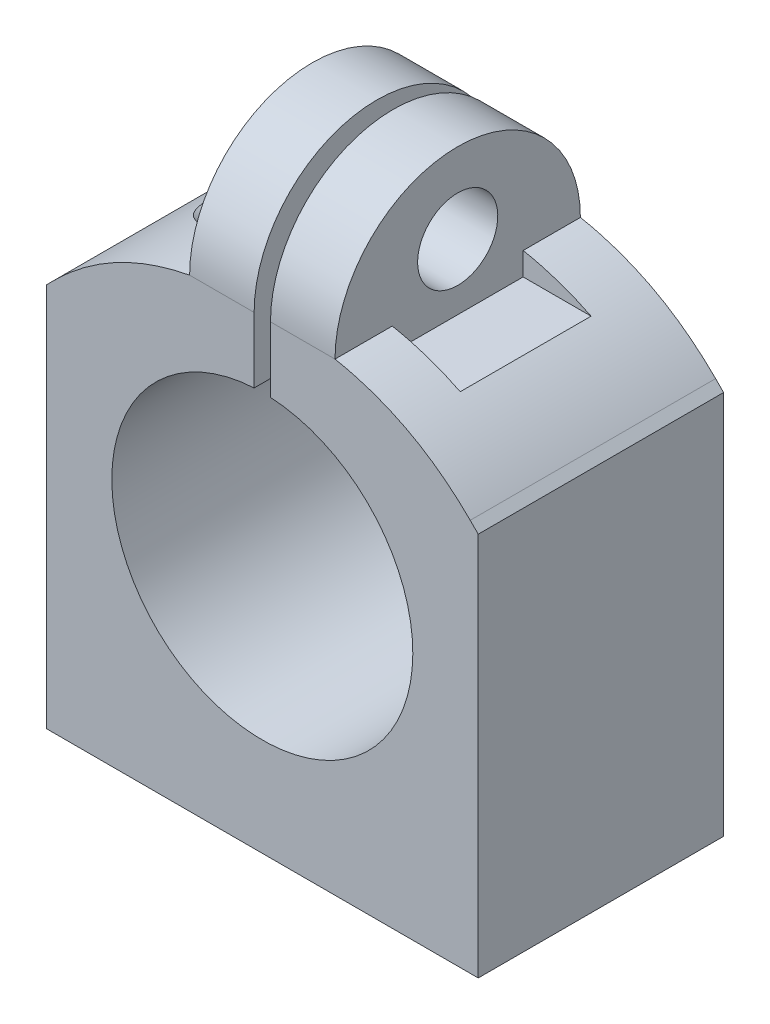
ISO-10303-21;
HEADER;
FILE_DESCRIPTION(('STEP AP214'),'2;1');
FILE_NAME('part.step','',(''),(''),'','','');
FILE_SCHEMA(('AUTOMOTIVE_DESIGN { 1 0 10303 214 1 1 1 1 }'));
ENDSEC;
DATA;
#1=APPLICATION_CONTEXT('core data for automotive mechanical design processes');
#2=APPLICATION_PROTOCOL_DEFINITION('international standard','automotive_design',2000,#1);
#3=PRODUCT_CONTEXT('',#1,'mechanical');
#4=PRODUCT('Part','Part','',(#3));
#5=PRODUCT_RELATED_PRODUCT_CATEGORY('part','',(#4));
#6=PRODUCT_DEFINITION_FORMATION('','',#4);
#7=PRODUCT_DEFINITION_CONTEXT('part definition',#1,'design');
#8=PRODUCT_DEFINITION('design','',#6,#7);
#9=PRODUCT_DEFINITION_SHAPE('','',#8);
#10=(LENGTH_UNIT() NAMED_UNIT(*) SI_UNIT(.MILLI.,.METRE.));
#11=(NAMED_UNIT(*) PLANE_ANGLE_UNIT() SI_UNIT($,.RADIAN.));
#12=(NAMED_UNIT(*) SI_UNIT($,.STERADIAN.) SOLID_ANGLE_UNIT());
#13=UNCERTAINTY_MEASURE_WITH_UNIT(LENGTH_MEASURE(1.E-05),#10,'distance_accuracy_value','');
#14=(GEOMETRIC_REPRESENTATION_CONTEXT(3) GLOBAL_UNCERTAINTY_ASSIGNED_CONTEXT((#13)) GLOBAL_UNIT_ASSIGNED_CONTEXT((#10,
#11,#12)) REPRESENTATION_CONTEXT('',''));
#15=CARTESIAN_POINT('',(0.,0.,0.));
#16=DIRECTION('',(0.,0.,1.));
#17=DIRECTION('',(1.,0.,0.));
#18=AXIS2_PLACEMENT_3D('',#15,#16,#17);
#19=CARTESIAN_POINT('',(16.1412468034704,11.1587318045801,19.05));
#20=CARTESIAN_POINT('',(11.7116648310228,15.5883137770274,19.05));
#21=CARTESIAN_POINT('',(5.64388,16.7467318045801,19.05));
#22=B_SPLINE_CURVE_WITH_KNOTS('',2,(#19,#20,#21),.UNSPECIFIED.,.F.,.F.,(3,3),(0.,1.),.UNSPECIFIED.);
#23=DIRECTION('',(0.,0.,-1.));
#24=VECTOR('',#23,1.);
#25=SURFACE_OF_LINEAR_EXTRUSION('',#22,#24);
#26=CARTESIAN_POINT('',(16.1412468034704,11.1587318045801,14.605));
#27=CARTESIAN_POINT('',(11.7116648310228,15.5883137770274,14.605));
#28=CARTESIAN_POINT('',(5.64388,16.7467318045801,14.605));
#29=B_SPLINE_CURVE_WITH_KNOTS('',2,(#26,#27,#28),.UNSPECIFIED.,.F.,.F.,(3,3),(0.,1.),.UNSPECIFIED.);
#30=CARTESIAN_POINT('',(5.64388,16.7467318045801,14.605));
#31=VERTEX_POINT('',#30);
#32=CARTESIAN_POINT('',(10.9195458937569,14.9687318045801,14.605));
#33=VERTEX_POINT('',#32);
#34=EDGE_CURVE('E11',#31,#33,#29,.F.);
#35=ORIENTED_EDGE('',*,*,#34,.F.);
#36=DIRECTION('',(0.,0.,1.));
#37=VECTOR('',#36,1.);
#38=CARTESIAN_POINT('',(5.64388,16.7467318045801,19.05));
#39=LINE('',#38,#37);
#40=CARTESIAN_POINT('',(5.64388,16.7467318045801,19.05));
#41=VERTEX_POINT('',#40);
#42=EDGE_CURVE('E166',#31,#41,#39,.T.);
#43=ORIENTED_EDGE('',*,*,#42,.T.);
#44=CARTESIAN_POINT('',(16.1412468034704,11.1587318045801,19.05));
#45=VERTEX_POINT('',#44);
#46=EDGE_CURVE('E176',#45,#41,#22,.T.);
#47=ORIENTED_EDGE('',*,*,#46,.F.);
#48=DIRECTION('',(0.,0.,-1.));
#49=VECTOR('',#48,1.);
#50=CARTESIAN_POINT('',(16.1412468034704,11.1587318045801,19.05));
#51=LINE('',#50,#49);
#52=CARTESIAN_POINT('',(16.1412468034704,11.1587318045801,0.));
#53=VERTEX_POINT('',#52);
#54=EDGE_CURVE('E182',#45,#53,#51,.T.);
#55=ORIENTED_EDGE('',*,*,#54,.T.);
#56=CARTESIAN_POINT('',(16.1412468034704,11.1587318045801,0.));
#57=CARTESIAN_POINT('',(11.7116648310228,15.5883137770274,0.));
#58=CARTESIAN_POINT('',(5.64388,16.7467318045801,0.));
#59=B_SPLINE_CURVE_WITH_KNOTS('',2,(#56,#57,#58),.UNSPECIFIED.,.F.,.F.,(3,3),(0.,1.),.UNSPECIFIED.);
#60=CARTESIAN_POINT('',(5.64388,16.7467318045801,0.));
#61=VERTEX_POINT('',#60);
#62=EDGE_CURVE('E183',#53,#61,#59,.T.);
#63=ORIENTED_EDGE('',*,*,#62,.T.);
#64=CARTESIAN_POINT('',(5.64388,16.7467318045801,4.44500000000001));
#65=VERTEX_POINT('',#64);
#66=EDGE_CURVE('E244',#61,#65,#39,.T.);
#67=ORIENTED_EDGE('',*,*,#66,.T.);
#68=CARTESIAN_POINT('',(16.1412468034704,11.1587318045801,4.445));
#69=CARTESIAN_POINT('',(11.7116648310228,15.5883137770274,4.445));
#70=CARTESIAN_POINT('',(5.64388,16.7467318045801,4.445));
#71=B_SPLINE_CURVE_WITH_KNOTS('',2,(#68,#69,#70),.UNSPECIFIED.,.F.,.F.,(3,3),(0.,1.),.UNSPECIFIED.);
#72=CARTESIAN_POINT('',(10.9195458922964,14.9687318045801,4.445));
#73=VERTEX_POINT('',#72);
#74=EDGE_CURVE('E318',#73,#65,#71,.T.);
#75=ORIENTED_EDGE('',*,*,#74,.F.);
#76=DIRECTION('',(0.,0.,-1.));
#77=VECTOR('',#76,1.);
#78=CARTESIAN_POINT('',(10.9195458937569,14.9687318045801,19.05));
#79=LINE('',#78,#77);
#80=EDGE_CURVE('E47',#33,#73,#79,.T.);
#81=ORIENTED_EDGE('',*,*,#80,.F.);
#82=EDGE_LOOP('',(#35,#43,#47,#55,#63,#67,#75,#81));
#83=FACE_BOUND('',#82,.T.);
#84=ADVANCED_FACE('F37',(#83),#25,.F.);
#85=CARTESIAN_POINT('',(-5.64388,16.7467318045801,19.05));
#86=CARTESIAN_POINT('',(-11.7116648310228,15.5883137770274,19.05));
#87=CARTESIAN_POINT('',(-16.1412468034704,11.1587318045801,19.05));
#88=B_SPLINE_CURVE_WITH_KNOTS('',2,(#85,#86,#87),.UNSPECIFIED.,.F.,.F.,(3,3),(0.,1.),.UNSPECIFIED.);
#89=DIRECTION('',(0.,0.,-1.));
#90=VECTOR('',#89,1.);
#91=SURFACE_OF_LINEAR_EXTRUSION('',#88,#90);
#92=CARTESIAN_POINT('',(-5.64388,16.7467318045801,4.10104424796809));
#93=CARTESIAN_POINT('',(-5.83876272085071,16.7095333677369,4.12371118552078));
#94=CARTESIAN_POINT('',(-6.03291552509635,16.669687528954,4.14847334587737));
#95=CARTESIAN_POINT('',(-6.42041897900057,16.5845045130469,4.20294567316754));
#96=CARTESIAN_POINT('',(-6.61375979121458,16.5391391174929,4.2326815849274));
#97=CARTESIAN_POINT('',(-6.99878593010375,16.4429736227702,4.29772802620363));
#98=CARTESIAN_POINT('',(-7.19046448922835,16.3921575160689,4.33305512872525));
#99=CARTESIAN_POINT('',(-7.57130883909651,16.285258801679,4.41001039926246));
#100=CARTESIAN_POINT('',(-7.76047169686205,16.2291705731692,4.45164532189463));
#101=CARTESIAN_POINT('',(-8.1384334461401,16.1110617691429,4.54274110044235));
#102=CARTESIAN_POINT('',(-8.32718117117379,16.0489626645318,4.59231333799937));
#103=CARTESIAN_POINT('',(-8.70035594998138,15.9200003443668,4.69974230882234));
#104=CARTESIAN_POINT('',(-8.88478857207379,15.8531437764274,4.75758759207069));
#105=CARTESIAN_POINT('',(-9.24847194291285,15.7151892663587,4.88263388763812));
#106=CARTESIAN_POINT('',(-9.42773069763772,15.6440984635611,4.94981939314735));
#107=CARTESIAN_POINT('',(-9.78021787818885,15.4983240635529,5.09478004822136));
#108=CARTESIAN_POINT('',(-9.95345210020067,15.423644094103,5.17254464469194));
#109=CARTESIAN_POINT('',(-10.2538508399491,15.2890452447873,5.32078005501611));
#110=CARTESIAN_POINT('',(-10.3824590996691,15.2296750045255,5.38882469635271));
#111=CARTESIAN_POINT('',(-10.6348188685891,15.1098823752604,5.5326289379613));
#112=CARTESIAN_POINT('',(-10.7585700315244,15.0494599116853,5.6083890868961));
#113=CARTESIAN_POINT('',(-11.0001572622033,14.9283931495125,5.7680535626813));
#114=CARTESIAN_POINT('',(-11.1180056626025,14.8677496240033,5.85193973440194));
#115=CARTESIAN_POINT('',(-11.3471710685858,14.74695365979,6.0285598673157));
#116=CARTESIAN_POINT('',(-11.4584882072619,14.6868012111005,6.12129364811385));
#117=CARTESIAN_POINT('',(-11.675053905233,14.5671689612151,6.31745438366005));
#118=CARTESIAN_POINT('',(-11.7801957033445,14.5077103625798,6.42101285196015));
#119=CARTESIAN_POINT('',(-11.9814150120943,14.3916073119585,6.63803333137685));
#120=CARTESIAN_POINT('',(-12.0774950019625,14.3349620922766,6.75149261726766));
#121=CARTESIAN_POINT('',(-12.2590747629084,14.2259975320289,6.98822717781111));
#122=CARTESIAN_POINT('',(-12.3445911311581,14.1736714494493,7.11148654084756));
#123=CARTESIAN_POINT('',(-12.50367399398,14.0748542412786,7.36766340295111));
#124=CARTESIAN_POINT('',(-12.5772470218939,14.0283599287319,7.50057556367792));
#125=CARTESIAN_POINT('',(-12.6892812901978,13.9566911272709,7.73083636504465));
#126=CARTESIAN_POINT('',(-12.7314034760112,13.9294841013277,7.82578778200942));
#127=CARTESIAN_POINT('',(-12.8090062546073,13.8790019727924,8.01936726886827));
#128=CARTESIAN_POINT('',(-12.8444886864336,13.8557257816333,8.11799431160463));
#129=CARTESIAN_POINT('',(-12.9083698548833,13.8135816961148,8.31839990810833));
#130=CARTESIAN_POINT('',(-12.9367711292623,13.7947122226234,8.42017731809985));
#131=CARTESIAN_POINT('',(-12.9861276394158,13.7617832264626,8.62629638861711));
#132=CARTESIAN_POINT('',(-13.0070826199767,13.7477238686552,8.73063813690169));
#133=CARTESIAN_POINT('',(-13.0413182833062,13.7246937558235,8.94160495931614));
#134=CARTESIAN_POINT('',(-13.0545651464894,13.715745428703,9.04823799848435));
#135=CARTESIAN_POINT('',(-13.0730413587428,13.7032517060844,9.26251383059577));
#136=CARTESIAN_POINT('',(-13.0782707174686,13.6997063040795,9.37015662232277));
#137=CARTESIAN_POINT('',(-13.0806305513674,13.6981072821,9.58556032575658));
#138=CARTESIAN_POINT('',(-13.0777618779419,13.7000530847976,9.69332122385533));
#139=CARTESIAN_POINT('',(-13.0639719746091,13.7093865798133,9.90808460001552));
#140=CARTESIAN_POINT('',(-13.0530510576048,13.7167740606728,10.0150871073842));
#141=CARTESIAN_POINT('',(-13.0243003220101,13.7361500647924,10.2205222687062));
#142=CARTESIAN_POINT('',(-13.0069700443522,13.7478054225239,10.3190570796517));
#143=CARTESIAN_POINT('',(-12.9656424813872,13.7754682337352,10.5141274397921));
#144=CARTESIAN_POINT('',(-12.9416429185871,13.791477173879,10.6106622938996));
#145=CARTESIAN_POINT('',(-12.8872756405885,13.8275251653504,10.8011176147518));
#146=CARTESIAN_POINT('',(-12.856909751395,13.847563061016,10.895038822418));
#147=CARTESIAN_POINT('',(-12.7901497909373,13.8912995703308,11.0798512409421));
#148=CARTESIAN_POINT('',(-12.7537534681279,13.914999551046,11.1707413047972));
#149=CARTESIAN_POINT('',(-12.6310812355288,13.9942123282062,11.4496007746244));
#150=CARTESIAN_POINT('',(-12.5347885810566,14.0554966123291,11.6316386687529));
#151=CARTESIAN_POINT('',(-12.3204457555855,14.1886990054286,11.9779707488965));
#152=CARTESIAN_POINT('',(-12.202384878887,14.2606223432781,12.1422561408286));
#153=CARTESIAN_POINT('',(-11.9747808607574,14.3954917978361,12.4201678703153));
#154=CARTESIAN_POINT('',(-11.868604241511,14.4571777829359,12.5372103314103));
#155=CARTESIAN_POINT('',(-11.6465148452589,14.5831654964753,12.7601963322073));
#156=CARTESIAN_POINT('',(-11.5305975001434,14.6474684448204,12.86613461145));
#157=CARTESIAN_POINT('',(-11.2902921910183,14.7773577040348,13.0675279098388));
#158=CARTESIAN_POINT('',(-11.1658892898411,14.8429461251835,13.1629636273245));
#159=CARTESIAN_POINT('',(-10.9099994529037,14.9741402999367,13.3438349452192));
#160=CARTESIAN_POINT('',(-10.7785101155373,15.0397460518233,13.4292671238924));
#161=CARTESIAN_POINT('',(-10.4347389601138,15.2062083188998,13.6357892226522));
#162=CARTESIAN_POINT('',(-10.2181699380064,15.3063916149077,13.7503079955165));
#163=CARTESIAN_POINT('',(-9.77363074766146,15.5017626094611,13.9598727849418));
#164=CARTESIAN_POINT('',(-9.5456535460309,15.5969471501785,14.0549065999119));
#165=CARTESIAN_POINT('',(-9.08019752121372,15.7807308995197,14.2284752220874));
#166=CARTESIAN_POINT('',(-8.84269467758003,15.8693116097939,14.3069647315274));
#167=CARTESIAN_POINT('',(-8.36074432347158,16.038401332662,14.4496301409447));
#168=CARTESIAN_POINT('',(-8.11629865886327,16.1189124653809,14.513809806011));
#169=CARTESIAN_POINT('',(-7.68761815235323,16.2509424615441,14.6146189977766));
#170=CARTESIAN_POINT('',(-7.50464513904355,16.3044802058054,14.6540374701162));
#171=CARTESIAN_POINT('',(-7.13620926034942,16.4066768073338,14.7271035544538));
#172=CARTESIAN_POINT('',(-6.95074648150425,16.4553358336801,14.7607513664713));
#173=CARTESIAN_POINT('',(-6.5793180135364,16.5472896174873,14.8226845179848));
#174=CARTESIAN_POINT('',(-6.39336968067552,16.5906260586288,14.8510125884162));
#175=CARTESIAN_POINT('',(-6.01980195997387,16.6723750312542,14.9031978958133));
#176=CARTESIAN_POINT('',(-5.83218285895034,16.7107883910872,14.92705588522));
#177=CARTESIAN_POINT('',(-5.64388,16.7467318045801,14.9489557520319));
#178=B_SPLINE_CURVE_WITH_KNOTS('',3,(#92,#93,#94,#95,#96,#97,#98,#99,#100,#101,#102,#103,#104,
#105,#106,#107,#108,#109,#110,#111,#112,#113,#114,#115,#116,#117,#118,#119,#120,#121,#122,#123,
#124,#125,#126,#127,#128,#129,#130,#131,#132,#133,#134,#135,#136,#137,#138,#139,#140,#141,#142,
#143,#144,#145,#146,#147,#148,#149,#150,#151,#152,#153,#154,#155,#156,#157,#158,#159,#160,#161,
#162,#163,#164,#165,#166,#167,#168,#169,#170,#171,#172,#173,#174,#175,#176,#177),.UNSPECIFIED.,
.F.,.F.,(4,2,2,2,2,2,2,2,2,2,2,2,2,2,2,2,2,2,2,2,2,2,2,2,2,2,2,2,2,2,2,2,2,2,2,2,2,2,2,2,2,2,4),
(0.,0.599073305745289,1.20134931860823,1.80544519447173,2.41019258857334,3.02432119896611,
3.63760792684838,4.24988836120451,4.86156243818613,5.33276657234744,5.80400423806,
6.27421233815587,6.74441085317078,7.22119127270201,7.69784086865633,8.17373177878995,
8.64936147957325,8.97119605838603,9.292941364806,9.61457119738968,9.93621205241921,
10.2592536773561,10.582294913248,10.9053021868708,11.2282969093897,11.5301294971872,
11.8320652846739,12.1339145884005,12.4358768467247,13.0778640988304,13.7201679291255,
14.2283922172134,14.7368561919043,15.2462395456617,15.755796629435,16.5485531217243,
17.341804536553,18.1372004181867,18.9323867741661,19.5162597332789,20.1001124504068,
20.6790534583325,21.2578969263897),.UNSPECIFIED.);
#179=CARTESIAN_POINT('',(-5.64388,16.7467318045801,4.10104424796809));
#180=VERTEX_POINT('',#179);
#181=CARTESIAN_POINT('',(-5.64388,16.7467318045801,14.9489557520319));
#182=VERTEX_POINT('',#181);
#183=EDGE_CURVE('E312',#180,#182,#178,.T.);
#184=ORIENTED_EDGE('',*,*,#183,.F.);
#185=DIRECTION('',(0.,0.,1.));
#186=VECTOR('',#185,1.);
#187=CARTESIAN_POINT('',(-5.64388,16.7467318045801,19.05));
#188=LINE('',#187,#186);
#189=CARTESIAN_POINT('',(-5.64388,16.7467318045801,0.));
#190=VERTEX_POINT('',#189);
#191=EDGE_CURVE('E231',#190,#180,#188,.T.);
#192=ORIENTED_EDGE('',*,*,#191,.F.);
#193=CARTESIAN_POINT('',(-5.64388,16.7467318045801,0.));
#194=CARTESIAN_POINT('',(-11.7116648310228,15.5883137770274,0.));
#195=CARTESIAN_POINT('',(-16.1412468034704,11.1587318045801,0.));
#196=B_SPLINE_CURVE_WITH_KNOTS('',2,(#193,#194,#195),.UNSPECIFIED.,.F.,.F.,(3,3),(0.,1.),.UNSPECIFIED.);
#197=CARTESIAN_POINT('',(-16.1412468034704,11.1587318045801,0.));
#198=VERTEX_POINT('',#197);
#199=EDGE_CURVE('E214',#190,#198,#196,.T.);
#200=ORIENTED_EDGE('',*,*,#199,.T.);
#201=DIRECTION('',(0.,0.,-1.));
#202=VECTOR('',#201,1.);
#203=CARTESIAN_POINT('',(-16.1412468034704,11.1587318045801,19.05));
#204=LINE('',#203,#202);
#205=CARTESIAN_POINT('',(-16.1412468034704,11.1587318045801,19.05));
#206=VERTEX_POINT('',#205);
#207=EDGE_CURVE('E175',#206,#198,#204,.T.);
#208=ORIENTED_EDGE('',*,*,#207,.F.);
#209=CARTESIAN_POINT('',(-5.64388,16.7467318045801,19.05));
#210=VERTEX_POINT('',#209);
#211=EDGE_CURVE('E207',#210,#206,#88,.T.);
#212=ORIENTED_EDGE('',*,*,#211,.F.);
#213=EDGE_CURVE('E230',#182,#210,#188,.T.);
#214=ORIENTED_EDGE('',*,*,#213,.F.);
#215=EDGE_LOOP('',(#184,#192,#200,#208,#212,#214));
#216=FACE_BOUND('',#215,.T.);
#217=ADVANCED_FACE('F194',(#216),#91,.F.);
#218=CARTESIAN_POINT('',(-0.635,11.6667318045801,19.05));
#219=DIRECTION('',(-1.,0.,0.));
#220=DIRECTION('',(0.,0.,1.));
#221=AXIS2_PLACEMENT_3D('',#218,#219,#220);
#222=PLANE('',#221);
#223=DIRECTION('',(0.,1.,0.));
#224=VECTOR('',#223,1.);
#225=CARTESIAN_POINT('',(-0.635,11.6667318045801,0.));
#226=LINE('',#225,#224);
#227=CARTESIAN_POINT('',(-0.634999999999999,11.6667318045801,0.));
#228=VERTEX_POINT('',#227);
#229=CARTESIAN_POINT('',(-0.635,16.7467318045801,0.));
#230=VERTEX_POINT('',#229);
#231=EDGE_CURVE('E252',#228,#230,#226,.T.);
#232=ORIENTED_EDGE('',*,*,#231,.T.);
#233=CARTESIAN_POINT('',(-0.635,16.7467318045801,9.525));
#234=DIRECTION('',(-1.,0.,0.));
#235=DIRECTION('',(0.,-1.,0.));
#236=AXIS2_PLACEMENT_3D('',#233,#234,#235);
#237=CIRCLE('',#236,9.525);
#238=CARTESIAN_POINT('',(-0.635,16.7467318045801,19.05));
#239=VERTEX_POINT('',#238);
#240=EDGE_CURVE('E224',#239,#230,#237,.T.);
#241=ORIENTED_EDGE('',*,*,#240,.F.);
#242=DIRECTION('',(0.,1.,0.));
#243=VECTOR('',#242,1.);
#244=CARTESIAN_POINT('',(-0.635,11.6667318045801,19.05));
#245=LINE('',#244,#243);
#246=CARTESIAN_POINT('',(-0.634999999999999,11.6667318045801,19.05));
#247=VERTEX_POINT('',#246);
#248=EDGE_CURVE('E255',#247,#239,#245,.T.);
#249=ORIENTED_EDGE('',*,*,#248,.F.);
#250=DIRECTION('',(0.,0.,-1.));
#251=VECTOR('',#250,1.);
#252=CARTESIAN_POINT('',(-0.634999999999999,11.6667318045801,19.05));
#253=LINE('',#252,#251);
#254=EDGE_CURVE('E276',#247,#228,#253,.T.);
#255=ORIENTED_EDGE('',*,*,#254,.T.);
#256=EDGE_LOOP('',(#232,#241,#249,#255));
#257=FACE_BOUND('',#256,.T.);
#258=CARTESIAN_POINT('',(-0.635000000000001,20.0487318045801,9.525));
#259=DIRECTION('',(-1.,0.,0.));
#260=DIRECTION('',(0.,-1.,0.));
#261=AXIS2_PLACEMENT_3D('',#258,#259,#260);
#262=CIRCLE('',#261,3.1115);
#263=CARTESIAN_POINT('',(-0.635,16.9372318045801,9.525));
#264=VERTEX_POINT('',#263);
#265=EDGE_CURVE('E225',#264,#264,#262,.T.);
#266=ORIENTED_EDGE('',*,*,#265,.T.);
#267=EDGE_LOOP('',(#266));
#268=FACE_BOUND('',#267,.T.);
#269=ADVANCED_FACE('F39',(#257,#268),#222,.F.);
#270=CARTESIAN_POINT('',(-16.764,10.5359786080503,19.05));
#271=DIRECTION('',(0.707106781186543,-0.707106781186552,0.));
#272=DIRECTION('',(0.707106781186552,0.707106781186543,0.));
#273=AXIS2_PLACEMENT_3D('',#270,#271,#272);
#274=PLANE('',#273);
#275=DIRECTION('',(-0.707106781186552,-0.707106781186543,0.));
#276=VECTOR('',#275,1.);
#277=CARTESIAN_POINT('',(-16.764,10.5359786080503,19.05));
#278=LINE('',#277,#276);
#279=CARTESIAN_POINT('',(-16.764,10.5359786080503,19.05));
#280=VERTEX_POINT('',#279);
#281=EDGE_CURVE('E261',#206,#280,#278,.T.);
#282=ORIENTED_EDGE('',*,*,#281,.F.);
#283=ORIENTED_EDGE('',*,*,#207,.T.);
#284=DIRECTION('',(-0.707106781186552,-0.707106781186543,0.));
#285=VECTOR('',#284,1.);
#286=CARTESIAN_POINT('',(-16.764,10.5359786080503,0.));
#287=LINE('',#286,#285);
#288=CARTESIAN_POINT('',(-16.764,10.5359786080503,0.));
#289=VERTEX_POINT('',#288);
#290=EDGE_CURVE('E282',#198,#289,#287,.T.);
#291=ORIENTED_EDGE('',*,*,#290,.T.);
#292=DIRECTION('',(0.,0.,-1.));
#293=VECTOR('',#292,1.);
#294=CARTESIAN_POINT('',(-16.764,10.5359786080503,19.05));
#295=LINE('',#294,#293);
#296=EDGE_CURVE('E310',#280,#289,#295,.T.);
#297=ORIENTED_EDGE('',*,*,#296,.F.);
#298=EDGE_LOOP('',(#282,#283,#291,#297));
#299=FACE_BOUND('',#298,.T.);
#300=ADVANCED_FACE('F366',(#299),#274,.F.);
#301=CARTESIAN_POINT('',(-16.764,-19.304,19.05));
#302=DIRECTION('',(1.,0.,0.));
#303=DIRECTION('',(0.,0.,-1.));
#304=AXIS2_PLACEMENT_3D('',#301,#302,#303);
#305=PLANE('',#304);
#306=DIRECTION('',(0.,-1.,0.));
#307=VECTOR('',#306,1.);
#308=CARTESIAN_POINT('',(-16.764,-19.304,0.));
#309=LINE('',#308,#307);
#310=CARTESIAN_POINT('',(-16.764,-19.304,0.));
#311=VERTEX_POINT('',#310);
#312=EDGE_CURVE('E284',#289,#311,#309,.T.);
#313=ORIENTED_EDGE('',*,*,#312,.T.);
#314=DIRECTION('',(0.,0.,-1.));
#315=VECTOR('',#314,1.);
#316=CARTESIAN_POINT('',(-16.764,-19.304,19.05));
#317=LINE('',#316,#315);
#318=CARTESIAN_POINT('',(-16.764,-19.304,19.05));
#319=VERTEX_POINT('',#318);
#320=EDGE_CURVE('E307',#319,#311,#317,.T.);
#321=ORIENTED_EDGE('',*,*,#320,.F.);
#322=DIRECTION('',(0.,-1.,0.));
#323=VECTOR('',#322,1.);
#324=CARTESIAN_POINT('',(-16.764,-19.304,19.05));
#325=LINE('',#324,#323);
#326=EDGE_CURVE('E263',#280,#319,#325,.T.);
#327=ORIENTED_EDGE('',*,*,#326,.F.);
#328=ORIENTED_EDGE('',*,*,#296,.T.);
#329=EDGE_LOOP('',(#313,#321,#327,#328));
#330=FACE_BOUND('',#329,.T.);
#331=ADVANCED_FACE('F386',(#330),#305,.F.);
#332=CARTESIAN_POINT('',(-16.764,-19.304,19.05));
#333=DIRECTION('',(0.,1.,0.));
#334=DIRECTION('',(0.,0.,1.));
#335=AXIS2_PLACEMENT_3D('',#332,#333,#334);
#336=PLANE('',#335);
#337=DIRECTION('',(1.,0.,0.));
#338=VECTOR('',#337,1.);
#339=CARTESIAN_POINT('',(-16.764,-19.304,0.));
#340=LINE('',#339,#338);
#341=CARTESIAN_POINT('',(16.764,-19.304,0.));
#342=VERTEX_POINT('',#341);
#343=EDGE_CURVE('E286',#311,#342,#340,.T.);
#344=ORIENTED_EDGE('',*,*,#343,.T.);
#345=DIRECTION('',(0.,0.,-1.));
#346=VECTOR('',#345,1.);
#347=CARTESIAN_POINT('',(16.764,-19.304,19.05));
#348=LINE('',#347,#346);
#349=CARTESIAN_POINT('',(16.764,-19.304,19.05));
#350=VERTEX_POINT('',#349);
#351=EDGE_CURVE('E304',#350,#342,#348,.T.);
#352=ORIENTED_EDGE('',*,*,#351,.F.);
#353=DIRECTION('',(1.,0.,0.));
#354=VECTOR('',#353,1.);
#355=CARTESIAN_POINT('',(-16.764,-19.304,19.05));
#356=LINE('',#355,#354);
#357=EDGE_CURVE('E265',#319,#350,#356,.T.);
#358=ORIENTED_EDGE('',*,*,#357,.F.);
#359=ORIENTED_EDGE('',*,*,#320,.T.);
#360=EDGE_LOOP('',(#344,#352,#358,#359));
#361=FACE_BOUND('',#360,.T.);
#362=ADVANCED_FACE('F381',(#361),#336,.F.);
#363=CARTESIAN_POINT('',(16.764,-19.304,19.05));
#364=DIRECTION('',(-1.,0.,0.));
#365=DIRECTION('',(0.,-1.,0.));
#366=AXIS2_PLACEMENT_3D('',#363,#364,#365);
#367=PLANE('',#366);
#368=DIRECTION('',(0.,1.,0.));
#369=VECTOR('',#368,1.);
#370=CARTESIAN_POINT('',(16.764,-19.304,0.));
#371=LINE('',#370,#369);
#372=CARTESIAN_POINT('',(16.764,10.5359786080503,0.));
#373=VERTEX_POINT('',#372);
#374=EDGE_CURVE('E288',#342,#373,#371,.T.);
#375=ORIENTED_EDGE('',*,*,#374,.T.);
#376=DIRECTION('',(0.,0.,-1.));
#377=VECTOR('',#376,1.);
#378=CARTESIAN_POINT('',(16.764,10.5359786080503,19.05));
#379=LINE('',#378,#377);
#380=CARTESIAN_POINT('',(16.764,10.5359786080503,19.05));
#381=VERTEX_POINT('',#380);
#382=EDGE_CURVE('E301',#381,#373,#379,.T.);
#383=ORIENTED_EDGE('',*,*,#382,.F.);
#384=DIRECTION('',(0.,1.,0.));
#385=VECTOR('',#384,1.);
#386=CARTESIAN_POINT('',(16.764,-19.304,19.05));
#387=LINE('',#386,#385);
#388=EDGE_CURVE('E267',#350,#381,#387,.T.);
#389=ORIENTED_EDGE('',*,*,#388,.F.);
#390=ORIENTED_EDGE('',*,*,#351,.T.);
#391=EDGE_LOOP('',(#375,#383,#389,#390));
#392=FACE_BOUND('',#391,.T.);
#393=ADVANCED_FACE('F377',(#392),#367,.F.);
#394=CARTESIAN_POINT('',(16.764,10.5359786080503,19.05));
#395=DIRECTION('',(-0.707106781186543,-0.707106781186552,0.));
#396=DIRECTION('',(0.707106781186552,-0.707106781186543,0.));
#397=AXIS2_PLACEMENT_3D('',#394,#395,#396);
#398=PLANE('',#397);
#399=DIRECTION('',(-0.707106781186552,0.707106781186543,0.));
#400=VECTOR('',#399,1.);
#401=CARTESIAN_POINT('',(16.764,10.5359786080503,0.));
#402=LINE('',#401,#400);
#403=EDGE_CURVE('E290',#373,#53,#402,.T.);
#404=ORIENTED_EDGE('',*,*,#403,.T.);
#405=ORIENTED_EDGE('',*,*,#54,.F.);
#406=DIRECTION('',(-0.707106781186552,0.707106781186543,0.));
#407=VECTOR('',#406,1.);
#408=CARTESIAN_POINT('',(16.764,10.5359786080503,19.05));
#409=LINE('',#408,#407);
#410=EDGE_CURVE('E269',#381,#45,#409,.T.);
#411=ORIENTED_EDGE('',*,*,#410,.F.);
#412=ORIENTED_EDGE('',*,*,#382,.T.);
#413=EDGE_LOOP('',(#404,#405,#411,#412));
#414=FACE_BOUND('',#413,.T.);
#415=ADVANCED_FACE('F373',(#414),#398,.F.);
#416=CARTESIAN_POINT('',(0.635,11.6667318045801,19.05));
#417=DIRECTION('',(1.,0.,0.));
#418=DIRECTION('',(0.,0.,-1.));
#419=AXIS2_PLACEMENT_3D('',#416,#417,#418);
#420=PLANE('',#419);
#421=DIRECTION('',(0.,-1.,0.));
#422=VECTOR('',#421,1.);
#423=CARTESIAN_POINT('',(0.635,11.6667318045801,0.));
#424=LINE('',#423,#422);
#425=CARTESIAN_POINT('',(0.635,16.7467318045801,0.));
#426=VERTEX_POINT('',#425);
#427=CARTESIAN_POINT('',(0.635,11.6667318045801,0.));
#428=VERTEX_POINT('',#427);
#429=EDGE_CURVE('E293',#426,#428,#424,.T.);
#430=ORIENTED_EDGE('',*,*,#429,.T.);
#431=DIRECTION('',(0.,0.,-1.));
#432=VECTOR('',#431,1.);
#433=CARTESIAN_POINT('',(0.635,11.6667318045801,19.05));
#434=LINE('',#433,#432);
#435=CARTESIAN_POINT('',(0.635,11.6667318045801,19.05));
#436=VERTEX_POINT('',#435);
#437=EDGE_CURVE('E298',#436,#428,#434,.T.);
#438=ORIENTED_EDGE('',*,*,#437,.F.);
#439=DIRECTION('',(0.,-1.,0.));
#440=VECTOR('',#439,1.);
#441=CARTESIAN_POINT('',(0.635,11.6667318045801,19.05));
#442=LINE('',#441,#440);
#443=CARTESIAN_POINT('',(0.635,16.7467318045801,19.05));
#444=VERTEX_POINT('',#443);
#445=EDGE_CURVE('E272',#444,#436,#442,.T.);
#446=ORIENTED_EDGE('',*,*,#445,.F.);
#447=CARTESIAN_POINT('',(0.635,16.7467318045801,9.525));
#448=DIRECTION('',(-1.,0.,0.));
#449=DIRECTION('',(0.,-1.,0.));
#450=AXIS2_PLACEMENT_3D('',#447,#448,#449);
#451=CIRCLE('',#450,9.525);
#452=EDGE_CURVE('E239',#444,#426,#451,.T.);
#453=ORIENTED_EDGE('',*,*,#452,.T.);
#454=EDGE_LOOP('',(#430,#438,#446,#453));
#455=FACE_BOUND('',#454,.T.);
#456=CARTESIAN_POINT('',(0.635000000000001,20.0487318045801,9.525));
#457=DIRECTION('',(-1.,0.,0.));
#458=DIRECTION('',(0.,-1.,0.));
#459=AXIS2_PLACEMENT_3D('',#456,#457,#458);
#460=CIRCLE('',#459,3.1115);
#461=CARTESIAN_POINT('',(0.635,16.9372318045801,9.525));
#462=VERTEX_POINT('',#461);
#463=EDGE_CURVE('E233',#462,#462,#460,.T.);
#464=ORIENTED_EDGE('',*,*,#463,.F.);
#465=EDGE_LOOP('',(#464));
#466=FACE_BOUND('',#465,.T.);
#467=ADVANCED_FACE('F339',(#455,#466),#420,.F.);
#468=CARTESIAN_POINT('',(0.,0.,19.05));
#469=DIRECTION('',(0.,0.,-1.));
#470=DIRECTION('',(-1.,0.,0.));
#471=AXIS2_PLACEMENT_3D('',#468,#469,#470);
#472=CYLINDRICAL_SURFACE('',#471,11.684);
#473=CARTESIAN_POINT('',(0.,0.,0.));
#474=DIRECTION('',(0.,0.,-1.));
#475=DIRECTION('',(1.,0.,0.));
#476=AXIS2_PLACEMENT_3D('',#473,#474,#475);
#477=CIRCLE('',#476,11.684);
#478=EDGE_CURVE('E258',#428,#228,#477,.T.);
#479=ORIENTED_EDGE('',*,*,#478,.T.);
#480=ORIENTED_EDGE('',*,*,#254,.F.);
#481=CARTESIAN_POINT('',(0.,0.,19.05));
#482=DIRECTION('',(0.,0.,-1.));
#483=DIRECTION('',(1.,0.,0.));
#484=AXIS2_PLACEMENT_3D('',#481,#482,#483);
#485=CIRCLE('',#484,11.684);
#486=EDGE_CURVE('E274',#436,#247,#485,.T.);
#487=ORIENTED_EDGE('',*,*,#486,.F.);
#488=ORIENTED_EDGE('',*,*,#437,.T.);
#489=EDGE_LOOP('',(#479,#480,#487,#488));
#490=FACE_BOUND('',#489,.T.);
#491=ADVANCED_FACE('F345',(#490),#472,.F.);
#492=CARTESIAN_POINT('',(0.,0.,19.05));
#493=DIRECTION('',(0.,0.,1.));
#494=DIRECTION('',(1.,0.,0.));
#495=AXIS2_PLACEMENT_3D('',#492,#493,#494);
#496=PLANE('',#495);
#497=ORIENTED_EDGE('',*,*,#46,.T.);
#498=DIRECTION('',(-1.,0.,0.));
#499=VECTOR('',#498,1.);
#500=CARTESIAN_POINT('',(5.64388,16.7467318045801,19.05));
#501=LINE('',#500,#499);
#502=EDGE_CURVE('E250',#41,#444,#501,.T.);
#503=ORIENTED_EDGE('',*,*,#502,.T.);
#504=ORIENTED_EDGE('',*,*,#445,.T.);
#505=ORIENTED_EDGE('',*,*,#486,.T.);
#506=ORIENTED_EDGE('',*,*,#248,.T.);
#507=DIRECTION('',(-1.,0.,0.));
#508=VECTOR('',#507,1.);
#509=CARTESIAN_POINT('',(-9.60163474963855,16.7467318045801,19.05));
#510=LINE('',#509,#508);
#511=EDGE_CURVE('E257',#239,#210,#510,.T.);
#512=ORIENTED_EDGE('',*,*,#511,.T.);
#513=ORIENTED_EDGE('',*,*,#211,.T.);
#514=ORIENTED_EDGE('',*,*,#281,.T.);
#515=ORIENTED_EDGE('',*,*,#326,.T.);
#516=ORIENTED_EDGE('',*,*,#357,.T.);
#517=ORIENTED_EDGE('',*,*,#388,.T.);
#518=ORIENTED_EDGE('',*,*,#410,.T.);
#519=EDGE_LOOP('',(#497,#503,#504,#505,#506,#512,#513,#514,#515,#516,#517,#518));
#520=FACE_BOUND('',#519,.T.);
#521=ADVANCED_FACE('F336',(#520),#496,.T.);
#522=CARTESIAN_POINT('',(0.,0.,0.));
#523=DIRECTION('',(0.,0.,1.));
#524=DIRECTION('',(1.,0.,0.));
#525=AXIS2_PLACEMENT_3D('',#522,#523,#524);
#526=PLANE('',#525);
#527=DIRECTION('',(-1.,0.,0.));
#528=VECTOR('',#527,1.);
#529=CARTESIAN_POINT('',(5.64388,16.7467318045801,0.));
#530=LINE('',#529,#528);
#531=EDGE_CURVE('E247',#61,#426,#530,.T.);
#532=ORIENTED_EDGE('',*,*,#531,.F.);
#533=ORIENTED_EDGE('',*,*,#62,.F.);
#534=ORIENTED_EDGE('',*,*,#403,.F.);
#535=ORIENTED_EDGE('',*,*,#374,.F.);
#536=ORIENTED_EDGE('',*,*,#343,.F.);
#537=ORIENTED_EDGE('',*,*,#312,.F.);
#538=ORIENTED_EDGE('',*,*,#290,.F.);
#539=ORIENTED_EDGE('',*,*,#199,.F.);
#540=DIRECTION('',(-1.,0.,0.));
#541=VECTOR('',#540,1.);
#542=CARTESIAN_POINT('',(-9.60163474963855,16.7467318045801,0.));
#543=LINE('',#542,#541);
#544=EDGE_CURVE('E279',#230,#190,#543,.T.);
#545=ORIENTED_EDGE('',*,*,#544,.F.);
#546=ORIENTED_EDGE('',*,*,#231,.F.);
#547=ORIENTED_EDGE('',*,*,#478,.F.);
#548=ORIENTED_EDGE('',*,*,#429,.F.);
#549=EDGE_LOOP('',(#532,#533,#534,#535,#536,#537,#538,#539,#545,#546,#547,#548));
#550=FACE_BOUND('',#549,.T.);
#551=ADVANCED_FACE('F356',(#550),#526,.F.);
#552=CARTESIAN_POINT('',(5.64388,16.7467318045801,9.525));
#553=DIRECTION('',(-1.,0.,0.));
#554=DIRECTION('',(0.,-1.,0.));
#555=AXIS2_PLACEMENT_3D('',#552,#553,#554);
#556=CYLINDRICAL_SURFACE('',#555,9.525);
#557=ORIENTED_EDGE('',*,*,#452,.F.);
#558=ORIENTED_EDGE('',*,*,#502,.F.);
#559=CARTESIAN_POINT('',(5.64388,16.7467318045801,9.525));
#560=DIRECTION('',(-1.,0.,0.));
#561=DIRECTION('',(0.,-1.,0.));
#562=AXIS2_PLACEMENT_3D('',#559,#560,#561);
#563=CIRCLE('',#562,9.525);
#564=EDGE_CURVE('E242',#41,#61,#563,.T.);
#565=ORIENTED_EDGE('',*,*,#564,.T.);
#566=ORIENTED_EDGE('',*,*,#531,.T.);
#567=EDGE_LOOP('',(#557,#558,#565,#566));
#568=FACE_BOUND('',#567,.T.);
#569=ADVANCED_FACE('F333',(#568),#556,.T.);
#570=CARTESIAN_POINT('',(5.64388,16.7467318045801,9.525));
#571=DIRECTION('',(-1.,0.,0.));
#572=DIRECTION('',(0.,-1.,0.));
#573=AXIS2_PLACEMENT_3D('',#570,#571,#572);
#574=PLANE('',#573);
#575=CARTESIAN_POINT('',(5.64388,20.0487318045801,9.525));
#576=DIRECTION('',(-1.,0.,0.));
#577=DIRECTION('',(0.,-1.,0.));
#578=AXIS2_PLACEMENT_3D('',#575,#576,#577);
#579=CIRCLE('',#578,3.1115);
#580=CARTESIAN_POINT('',(5.64388,16.9372318045801,9.525));
#581=VERTEX_POINT('',#580);
#582=EDGE_CURVE('E236',#581,#581,#579,.T.);
#583=ORIENTED_EDGE('',*,*,#582,.T.);
#584=EDGE_LOOP('',(#583));
#585=FACE_BOUND('',#584,.T.);
#586=ORIENTED_EDGE('',*,*,#66,.F.);
#587=ORIENTED_EDGE('',*,*,#564,.F.);
#588=ORIENTED_EDGE('',*,*,#42,.F.);
#589=DIRECTION('',(0.,-1.,0.));
#590=VECTOR('',#589,1.);
#591=CARTESIAN_POINT('',(5.64388,25.1287318045801,14.605));
#592=LINE('',#591,#590);
#593=CARTESIAN_POINT('',(5.64388,14.9687318045801,14.605));
#594=VERTEX_POINT('',#593);
#595=EDGE_CURVE('E155',#31,#594,#592,.T.);
#596=ORIENTED_EDGE('',*,*,#595,.T.);
#597=DIRECTION('',(0.,0.,-1.));
#598=VECTOR('',#597,1.);
#599=CARTESIAN_POINT('',(5.64388,14.9687318045801,14.605));
#600=LINE('',#599,#598);
#601=CARTESIAN_POINT('',(5.64388,14.9687318045801,4.445));
#602=VERTEX_POINT('',#601);
#603=EDGE_CURVE('E164',#594,#602,#600,.T.);
#604=ORIENTED_EDGE('',*,*,#603,.T.);
#605=DIRECTION('',(0.,1.,0.));
#606=VECTOR('',#605,1.);
#607=CARTESIAN_POINT('',(5.64388,25.1287318045801,4.445));
#608=LINE('',#607,#606);
#609=EDGE_CURVE('E54',#602,#65,#608,.T.);
#610=ORIENTED_EDGE('',*,*,#609,.T.);
#611=EDGE_LOOP('',(#586,#587,#588,#596,#604,#610));
#612=FACE_BOUND('',#611,.T.);
#613=ADVANCED_FACE('F163',(#585,#612),#574,.F.);
#614=CARTESIAN_POINT('',(5.64388,20.0487318045801,9.525));
#615=DIRECTION('',(-1.,0.,0.));
#616=DIRECTION('',(0.,-1.,0.));
#617=AXIS2_PLACEMENT_3D('',#614,#615,#616);
#618=CYLINDRICAL_SURFACE('',#617,3.1115);
#619=ORIENTED_EDGE('',*,*,#582,.F.);
#620=EDGE_LOOP('',(#619));
#621=FACE_BOUND('',#620,.T.);
#622=ORIENTED_EDGE('',*,*,#463,.T.);
#623=EDGE_LOOP('',(#622));
#624=FACE_BOUND('',#623,.T.);
#625=ADVANCED_FACE('F391',(#621,#624),#618,.F.);
#626=CARTESIAN_POINT('',(-5.64388,16.7467318045801,9.525));
#627=DIRECTION('',(1.,0.,0.));
#628=DIRECTION('',(0.,-1.,0.));
#629=AXIS2_PLACEMENT_3D('',#626,#627,#628);
#630=PLANE('',#629);
#631=CARTESIAN_POINT('',(-5.64388,16.7467318045801,9.525));
#632=DIRECTION('',(-1.,0.,0.));
#633=DIRECTION('',(0.,-1.,0.));
#634=AXIS2_PLACEMENT_3D('',#631,#632,#633);
#635=CIRCLE('',#634,9.525);
#636=EDGE_CURVE('E228',#210,#190,#635,.T.);
#637=ORIENTED_EDGE('',*,*,#636,.T.);
#638=ORIENTED_EDGE('',*,*,#191,.T.);
#639=CARTESIAN_POINT('',(-5.64388,20.0487318045801,9.525));
#640=DIRECTION('',(-1.,0.,0.));
#641=DIRECTION('',(0.,-1.,0.));
#642=AXIS2_PLACEMENT_3D('',#639,#640,#641);
#643=CIRCLE('',#642,6.35);
#644=EDGE_CURVE('E62',#180,#182,#643,.T.);
#645=ORIENTED_EDGE('',*,*,#644,.T.);
#646=ORIENTED_EDGE('',*,*,#213,.T.);
#647=EDGE_LOOP('',(#637,#638,#645,#646));
#648=FACE_BOUND('',#647,.T.);
#649=CARTESIAN_POINT('',(-5.64388,20.0487318045801,9.525));
#650=DIRECTION('',(-1.,0.,0.));
#651=DIRECTION('',(0.,-1.,0.));
#652=AXIS2_PLACEMENT_3D('',#649,#650,#651);
#653=CIRCLE('',#652,3.1115);
#654=CARTESIAN_POINT('',(-5.64388,16.9372318045801,9.525));
#655=VERTEX_POINT('',#654);
#656=EDGE_CURVE('E218',#655,#655,#653,.T.);
#657=ORIENTED_EDGE('',*,*,#656,.F.);
#658=EDGE_LOOP('',(#657));
#659=FACE_BOUND('',#658,.T.);
#660=ADVANCED_FACE('F388',(#648,#659),#630,.F.);
#661=CARTESIAN_POINT('',(-5.64388,16.7467318045801,9.525));
#662=DIRECTION('',(1.,0.,0.));
#663=DIRECTION('',(0.,1.,0.));
#664=AXIS2_PLACEMENT_3D('',#661,#662,#663);
#665=CYLINDRICAL_SURFACE('',#664,9.525);
#666=ORIENTED_EDGE('',*,*,#240,.T.);
#667=ORIENTED_EDGE('',*,*,#544,.T.);
#668=ORIENTED_EDGE('',*,*,#636,.F.);
#669=ORIENTED_EDGE('',*,*,#511,.F.);
#670=EDGE_LOOP('',(#666,#667,#668,#669));
#671=FACE_BOUND('',#670,.T.);
#672=ADVANCED_FACE('F352',(#671),#665,.T.);
#673=CARTESIAN_POINT('',(-5.64388,20.0487318045801,9.525));
#674=DIRECTION('',(1.,0.,0.));
#675=DIRECTION('',(0.,1.,0.));
#676=AXIS2_PLACEMENT_3D('',#673,#674,#675);
#677=CYLINDRICAL_SURFACE('',#676,3.1115);
#678=ORIENTED_EDGE('',*,*,#656,.T.);
#679=EDGE_LOOP('',(#678));
#680=FACE_BOUND('',#679,.T.);
#681=ORIENTED_EDGE('',*,*,#265,.F.);
#682=EDGE_LOOP('',(#681));
#683=FACE_BOUND('',#682,.T.);
#684=ADVANCED_FACE('F204',(#680,#683),#677,.F.);
#685=CARTESIAN_POINT('',(-16.764,20.0487318045801,9.525));
#686=DIRECTION('',(1.,0.,0.));
#687=DIRECTION('',(0.,1.,0.));
#688=AXIS2_PLACEMENT_3D('',#685,#686,#687);
#689=CYLINDRICAL_SURFACE('',#688,6.35);
#690=ORIENTED_EDGE('',*,*,#183,.T.);
#691=ORIENTED_EDGE('',*,*,#644,.F.);
#692=EDGE_LOOP('',(#690,#691));
#693=FACE_BOUND('',#692,.T.);
#694=ADVANCED_FACE('F196',(#693),#689,.F.);
#695=CARTESIAN_POINT('',(16.764,25.1287318045801,14.605));
#696=DIRECTION('',(0.,0.,-1.));
#697=DIRECTION('',(0.,1.,0.));
#698=AXIS2_PLACEMENT_3D('',#695,#696,#697);
#699=PLANE('',#698);
#700=ORIENTED_EDGE('',*,*,#34,.T.);
#701=DIRECTION('',(-1.,0.,0.));
#702=VECTOR('',#701,1.);
#703=CARTESIAN_POINT('',(16.764,14.9687318045801,14.605));
#704=LINE('',#703,#702);
#705=EDGE_CURVE('E152',#33,#594,#704,.T.);
#706=ORIENTED_EDGE('',*,*,#705,.T.);
#707=ORIENTED_EDGE('',*,*,#595,.F.);
#708=EDGE_LOOP('',(#700,#706,#707));
#709=FACE_BOUND('',#708,.T.);
#710=ADVANCED_FACE('F154',(#709),#699,.T.);
#711=CARTESIAN_POINT('',(16.764,14.9687318045801,14.605));
#712=DIRECTION('',(0.,1.,0.));
#713=DIRECTION('',(-1.,0.,0.));
#714=AXIS2_PLACEMENT_3D('',#711,#712,#713);
#715=PLANE('',#714);
#716=ORIENTED_EDGE('',*,*,#80,.T.);
#717=DIRECTION('',(-1.,0.,0.));
#718=VECTOR('',#717,1.);
#719=CARTESIAN_POINT('',(16.764,14.9687318045801,4.445));
#720=LINE('',#719,#718);
#721=EDGE_CURVE('E160',#73,#602,#720,.T.);
#722=ORIENTED_EDGE('',*,*,#721,.T.);
#723=ORIENTED_EDGE('',*,*,#603,.F.);
#724=ORIENTED_EDGE('',*,*,#705,.F.);
#725=EDGE_LOOP('',(#716,#722,#723,#724));
#726=FACE_BOUND('',#725,.T.);
#727=ADVANCED_FACE('F168',(#726),#715,.T.);
#728=CARTESIAN_POINT('',(16.764,25.1287318045801,4.445));
#729=DIRECTION('',(0.,0.,1.));
#730=DIRECTION('',(0.,-1.,0.));
#731=AXIS2_PLACEMENT_3D('',#728,#729,#730);
#732=PLANE('',#731);
#733=ORIENTED_EDGE('',*,*,#74,.T.);
#734=ORIENTED_EDGE('',*,*,#609,.F.);
#735=ORIENTED_EDGE('',*,*,#721,.F.);
#736=EDGE_LOOP('',(#733,#734,#735));
#737=FACE_BOUND('',#736,.T.);
#738=ADVANCED_FACE('F326',(#737),#732,.T.);
#739=CLOSED_SHELL('',(#84,#217,#269,#300,#331,#362,#393,#415,#467,#491,#521,#551,#569,#613,#625,
#660,#672,#684,#694,#710,#727,#738));
#740=MANIFOLD_SOLID_BREP('B2',#739);
#741=ADVANCED_BREP_SHAPE_REPRESENTATION('',(#18,#740),#14);
#742=SHAPE_DEFINITION_REPRESENTATION(#9,#741);
ENDSEC;
END-ISO-10303-21;
